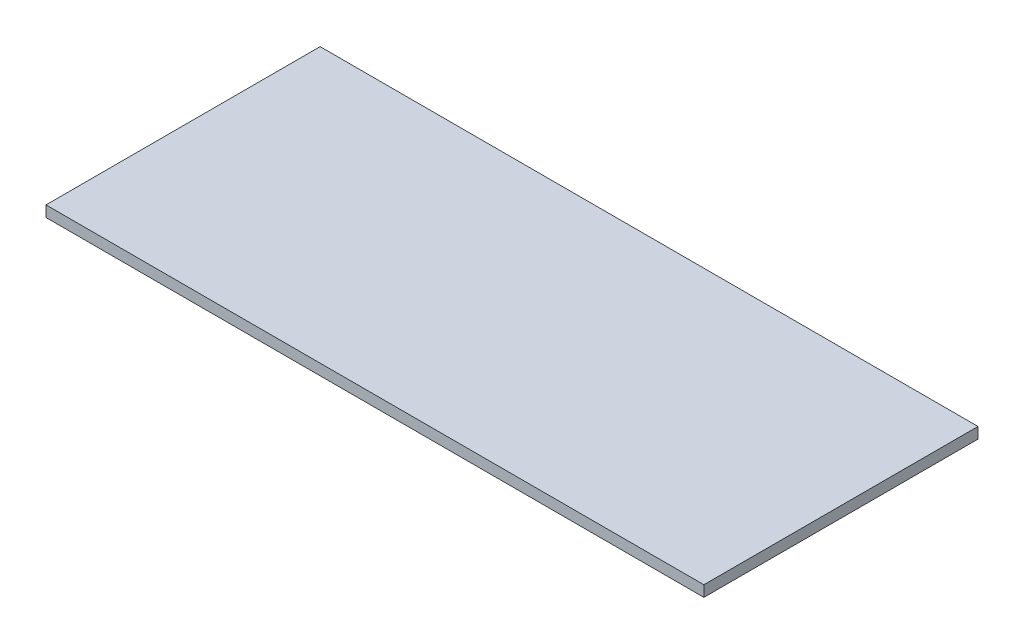
ISO-10303-21;
HEADER;
FILE_DESCRIPTION(('STEP AP214'),'2;1');
FILE_NAME('part.step','',(''),(''),'','','');
FILE_SCHEMA(('AUTOMOTIVE_DESIGN { 1 0 10303 214 1 1 1 1 }'));
ENDSEC;
DATA;
#1=APPLICATION_CONTEXT('core data for automotive mechanical design processes');
#2=APPLICATION_PROTOCOL_DEFINITION('international standard','automotive_design',2000,#1);
#3=PRODUCT_CONTEXT('',#1,'mechanical');
#4=PRODUCT('Part','Part','',(#3));
#5=PRODUCT_RELATED_PRODUCT_CATEGORY('part','',(#4));
#6=PRODUCT_DEFINITION_FORMATION('','',#4);
#7=PRODUCT_DEFINITION_CONTEXT('part definition',#1,'design');
#8=PRODUCT_DEFINITION('design','',#6,#7);
#9=PRODUCT_DEFINITION_SHAPE('','',#8);
#10=(LENGTH_UNIT() NAMED_UNIT(*) SI_UNIT(.MILLI.,.METRE.));
#11=(NAMED_UNIT(*) PLANE_ANGLE_UNIT() SI_UNIT($,.RADIAN.));
#12=(NAMED_UNIT(*) SI_UNIT($,.STERADIAN.) SOLID_ANGLE_UNIT());
#13=UNCERTAINTY_MEASURE_WITH_UNIT(LENGTH_MEASURE(1.E-05),#10,'distance_accuracy_value','');
#14=(GEOMETRIC_REPRESENTATION_CONTEXT(3) GLOBAL_UNCERTAINTY_ASSIGNED_CONTEXT((#13)) GLOBAL_UNIT_ASSIGNED_CONTEXT((#10,
#11,#12)) REPRESENTATION_CONTEXT('',''));
#15=CARTESIAN_POINT('',(0.,0.,0.));
#16=DIRECTION('',(0.,0.,1.));
#17=DIRECTION('',(1.,0.,0.));
#18=AXIS2_PLACEMENT_3D('',#15,#16,#17);
#19=CARTESIAN_POINT('',(240.,-4.,200.));
#20=DIRECTION('',(-1.,0.,0.));
#21=DIRECTION('',(0.,0.,1.));
#22=AXIS2_PLACEMENT_3D('',#19,#20,#21);
#23=PLANE('',#22);
#24=DIRECTION('',(0.,1.,0.));
#25=VECTOR('',#24,1.);
#26=CARTESIAN_POINT('',(240.,-4.,0.));
#27=LINE('',#26,#25);
#28=CARTESIAN_POINT('',(240.,-4.,0.));
#29=VERTEX_POINT('',#28);
#30=CARTESIAN_POINT('',(240.,4.,0.));
#31=VERTEX_POINT('',#30);
#32=EDGE_CURVE('E106',#29,#31,#27,.T.);
#33=ORIENTED_EDGE('',*,*,#32,.T.);
#34=DIRECTION('',(0.,0.,-1.));
#35=VECTOR('',#34,1.);
#36=CARTESIAN_POINT('',(240.,4.,200.));
#37=LINE('',#36,#35);
#38=CARTESIAN_POINT('',(240.,4.,200.));
#39=VERTEX_POINT('',#38);
#40=EDGE_CURVE('E11',#39,#31,#37,.T.);
#41=ORIENTED_EDGE('',*,*,#40,.F.);
#42=DIRECTION('',(0.,1.,0.));
#43=VECTOR('',#42,1.);
#44=CARTESIAN_POINT('',(240.,-4.,200.));
#45=LINE('',#44,#43);
#46=CARTESIAN_POINT('',(240.,-4.,200.));
#47=VERTEX_POINT('',#46);
#48=EDGE_CURVE('E88',#47,#39,#45,.T.);
#49=ORIENTED_EDGE('',*,*,#48,.F.);
#50=DIRECTION('',(0.,0.,-1.));
#51=VECTOR('',#50,1.);
#52=CARTESIAN_POINT('',(240.,-4.,200.));
#53=LINE('',#52,#51);
#54=EDGE_CURVE('E102',#47,#29,#53,.T.);
#55=ORIENTED_EDGE('',*,*,#54,.T.);
#56=EDGE_LOOP('',(#33,#41,#49,#55));
#57=FACE_BOUND('',#56,.T.);
#58=ADVANCED_FACE('F36',(#57),#23,.F.);
#59=CARTESIAN_POINT('',(-240.,4.,200.));
#60=DIRECTION('',(0.,-1.,0.));
#61=DIRECTION('',(0.,0.,-1.));
#62=AXIS2_PLACEMENT_3D('',#59,#60,#61);
#63=PLANE('',#62);
#64=DIRECTION('',(-1.,0.,0.));
#65=VECTOR('',#64,1.);
#66=CARTESIAN_POINT('',(-240.,4.,0.));
#67=LINE('',#66,#65);
#68=CARTESIAN_POINT('',(-240.,4.,0.));
#69=VERTEX_POINT('',#68);
#70=EDGE_CURVE('E93',#31,#69,#67,.T.);
#71=ORIENTED_EDGE('',*,*,#70,.T.);
#72=DIRECTION('',(0.,0.,-1.));
#73=VECTOR('',#72,1.);
#74=CARTESIAN_POINT('',(-240.,4.,200.));
#75=LINE('',#74,#73);
#76=CARTESIAN_POINT('',(-240.,4.,200.));
#77=VERTEX_POINT('',#76);
#78=EDGE_CURVE('E45',#77,#69,#75,.T.);
#79=ORIENTED_EDGE('',*,*,#78,.F.);
#80=DIRECTION('',(-1.,0.,0.));
#81=VECTOR('',#80,1.);
#82=CARTESIAN_POINT('',(-240.,4.,200.));
#83=LINE('',#82,#81);
#84=EDGE_CURVE('E83',#39,#77,#83,.T.);
#85=ORIENTED_EDGE('',*,*,#84,.F.);
#86=ORIENTED_EDGE('',*,*,#40,.T.);
#87=EDGE_LOOP('',(#71,#79,#85,#86));
#88=FACE_BOUND('',#87,.T.);
#89=ADVANCED_FACE('F92',(#88),#63,.F.);
#90=CARTESIAN_POINT('',(-240.,-4.,200.));
#91=DIRECTION('',(1.,0.,0.));
#92=DIRECTION('',(0.,0.,-1.));
#93=AXIS2_PLACEMENT_3D('',#90,#91,#92);
#94=PLANE('',#93);
#95=DIRECTION('',(0.,-1.,0.));
#96=VECTOR('',#95,1.);
#97=CARTESIAN_POINT('',(-240.,-4.,0.));
#98=LINE('',#97,#96);
#99=CARTESIAN_POINT('',(-240.,-4.,0.));
#100=VERTEX_POINT('',#99);
#101=EDGE_CURVE('E70',#69,#100,#98,.T.);
#102=ORIENTED_EDGE('',*,*,#101,.T.);
#103=DIRECTION('',(0.,0.,-1.));
#104=VECTOR('',#103,1.);
#105=CARTESIAN_POINT('',(-240.,-4.,200.));
#106=LINE('',#105,#104);
#107=CARTESIAN_POINT('',(-240.,-4.,200.));
#108=VERTEX_POINT('',#107);
#109=EDGE_CURVE('E95',#108,#100,#106,.T.);
#110=ORIENTED_EDGE('',*,*,#109,.F.);
#111=DIRECTION('',(0.,-1.,0.));
#112=VECTOR('',#111,1.);
#113=CARTESIAN_POINT('',(-240.,-4.,200.));
#114=LINE('',#113,#112);
#115=EDGE_CURVE('E86',#77,#108,#114,.T.);
#116=ORIENTED_EDGE('',*,*,#115,.F.);
#117=ORIENTED_EDGE('',*,*,#78,.T.);
#118=EDGE_LOOP('',(#102,#110,#116,#117));
#119=FACE_BOUND('',#118,.T.);
#120=ADVANCED_FACE('F96',(#119),#94,.F.);
#121=CARTESIAN_POINT('',(-240.,-4.,200.));
#122=DIRECTION('',(0.,1.,0.));
#123=DIRECTION('',(0.,0.,1.));
#124=AXIS2_PLACEMENT_3D('',#121,#122,#123);
#125=PLANE('',#124);
#126=DIRECTION('',(1.,0.,0.));
#127=VECTOR('',#126,1.);
#128=CARTESIAN_POINT('',(-240.,-4.,0.));
#129=LINE('',#128,#127);
#130=EDGE_CURVE('E76',#100,#29,#129,.T.);
#131=ORIENTED_EDGE('',*,*,#130,.T.);
#132=ORIENTED_EDGE('',*,*,#54,.F.);
#133=DIRECTION('',(1.,0.,0.));
#134=VECTOR('',#133,1.);
#135=CARTESIAN_POINT('',(-240.,-4.,200.));
#136=LINE('',#135,#134);
#137=EDGE_CURVE('E53',#108,#47,#136,.T.);
#138=ORIENTED_EDGE('',*,*,#137,.F.);
#139=ORIENTED_EDGE('',*,*,#109,.T.);
#140=EDGE_LOOP('',(#131,#132,#138,#139));
#141=FACE_BOUND('',#140,.T.);
#142=ADVANCED_FACE('F117',(#141),#125,.F.);
#143=CARTESIAN_POINT('',(0.,0.,200.));
#144=DIRECTION('',(0.,0.,-1.));
#145=DIRECTION('',(-1.,0.,0.));
#146=AXIS2_PLACEMENT_3D('',#143,#144,#145);
#147=PLANE('',#146);
#148=ORIENTED_EDGE('',*,*,#48,.T.);
#149=ORIENTED_EDGE('',*,*,#84,.T.);
#150=ORIENTED_EDGE('',*,*,#115,.T.);
#151=ORIENTED_EDGE('',*,*,#137,.T.);
#152=EDGE_LOOP('',(#148,#149,#150,#151));
#153=FACE_BOUND('',#152,.T.);
#154=ADVANCED_FACE('F84',(#153),#147,.F.);
#155=CARTESIAN_POINT('',(0.,0.,0.));
#156=DIRECTION('',(0.,0.,-1.));
#157=DIRECTION('',(-1.,0.,0.));
#158=AXIS2_PLACEMENT_3D('',#155,#156,#157);
#159=PLANE('',#158);
#160=ORIENTED_EDGE('',*,*,#32,.F.);
#161=ORIENTED_EDGE('',*,*,#130,.F.);
#162=ORIENTED_EDGE('',*,*,#101,.F.);
#163=ORIENTED_EDGE('',*,*,#70,.F.);
#164=EDGE_LOOP('',(#160,#161,#162,#163));
#165=FACE_BOUND('',#164,.T.);
#166=ADVANCED_FACE('F120',(#165),#159,.T.);
#167=CLOSED_SHELL('',(#58,#89,#120,#142,#154,#166));
#168=MANIFOLD_SOLID_BREP('B2',#167);
#169=ADVANCED_BREP_SHAPE_REPRESENTATION('',(#18,#168),#14);
#170=SHAPE_DEFINITION_REPRESENTATION(#9,#169);
ENDSEC;
END-ISO-10303-21;
